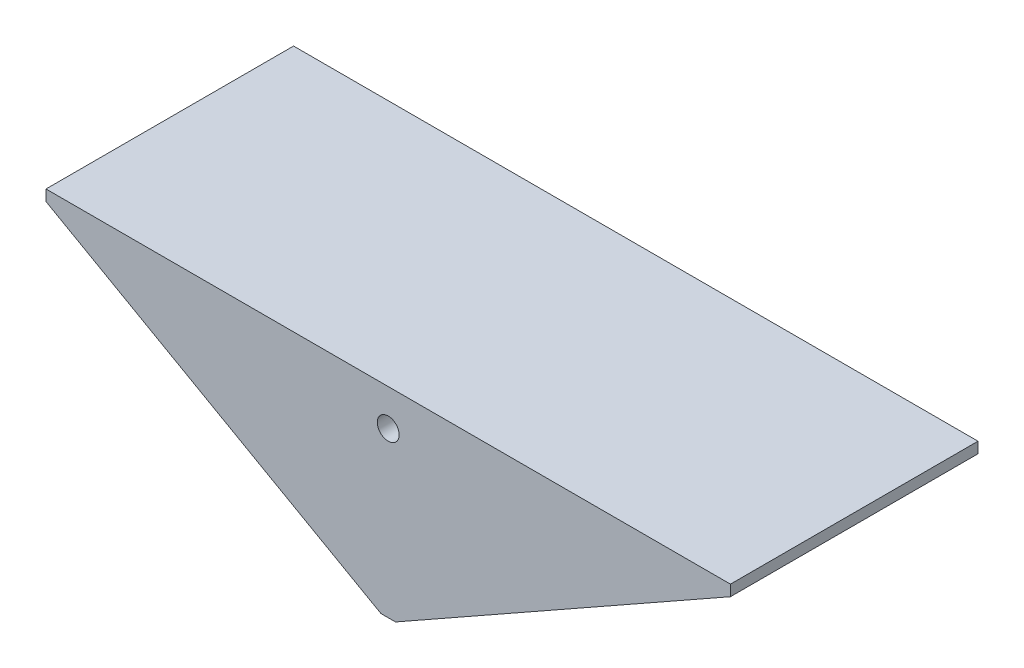
ISO-10303-21;
HEADER;
FILE_DESCRIPTION(('STEP AP214'),'2;1');
FILE_NAME('part.step','',(''),(''),'','','');
FILE_SCHEMA(('AUTOMOTIVE_DESIGN { 1 0 10303 214 1 1 1 1 }'));
ENDSEC;
DATA;
#1=APPLICATION_CONTEXT('core data for automotive mechanical design processes');
#2=APPLICATION_PROTOCOL_DEFINITION('international standard','automotive_design',2000,#1);
#3=PRODUCT_CONTEXT('',#1,'mechanical');
#4=PRODUCT('Part','Part','',(#3));
#5=PRODUCT_RELATED_PRODUCT_CATEGORY('part','',(#4));
#6=PRODUCT_DEFINITION_FORMATION('','',#4);
#7=PRODUCT_DEFINITION_CONTEXT('part definition',#1,'design');
#8=PRODUCT_DEFINITION('design','',#6,#7);
#9=PRODUCT_DEFINITION_SHAPE('','',#8);
#10=(LENGTH_UNIT() NAMED_UNIT(*) SI_UNIT(.MILLI.,.METRE.));
#11=(NAMED_UNIT(*) PLANE_ANGLE_UNIT() SI_UNIT($,.RADIAN.));
#12=(NAMED_UNIT(*) SI_UNIT($,.STERADIAN.) SOLID_ANGLE_UNIT());
#13=UNCERTAINTY_MEASURE_WITH_UNIT(LENGTH_MEASURE(1.E-05),#10,'distance_accuracy_value','');
#14=(GEOMETRIC_REPRESENTATION_CONTEXT(3) GLOBAL_UNCERTAINTY_ASSIGNED_CONTEXT((#13)) GLOBAL_UNIT_ASSIGNED_CONTEXT((#10,
#11,#12)) REPRESENTATION_CONTEXT('',''));
#15=CARTESIAN_POINT('',(0.,0.,0.));
#16=DIRECTION('',(0.,0.,1.));
#17=DIRECTION('',(1.,0.,0.));
#18=AXIS2_PLACEMENT_3D('',#15,#16,#17);
#19=CARTESIAN_POINT('',(0.,2.5,0.));
#20=DIRECTION('',(1.,0.,0.));
#21=DIRECTION('',(0.,0.,-1.));
#22=AXIS2_PLACEMENT_3D('',#19,#20,#21);
#23=PLANE('',#22);
#24=DIRECTION('',(0.,-1.,0.));
#25=VECTOR('',#24,1.);
#26=CARTESIAN_POINT('',(0.,2.5,-34.));
#27=LINE('',#26,#25);
#28=CARTESIAN_POINT('',(0.,2.5,-34.));
#29=VERTEX_POINT('',#28);
#30=CARTESIAN_POINT('',(0.,1.,-34.));
#31=VERTEX_POINT('',#30);
#32=EDGE_CURVE('E265',#29,#31,#27,.T.);
#33=ORIENTED_EDGE('',*,*,#32,.T.);
#34=DIRECTION('',(0.,0.,-1.));
#35=VECTOR('',#34,1.);
#36=CARTESIAN_POINT('',(0.,1.,0.));
#37=LINE('',#36,#35);
#38=CARTESIAN_POINT('',(0.,1.,0.));
#39=VERTEX_POINT('',#38);
#40=EDGE_CURVE('E206',#39,#31,#37,.T.);
#41=ORIENTED_EDGE('',*,*,#40,.F.);
#42=DIRECTION('',(0.,-1.,0.));
#43=VECTOR('',#42,1.);
#44=CARTESIAN_POINT('',(0.,2.5,0.));
#45=LINE('',#44,#43);
#46=CARTESIAN_POINT('',(0.,2.5,0.));
#47=VERTEX_POINT('',#46);
#48=EDGE_CURVE('E274',#47,#39,#45,.T.);
#49=ORIENTED_EDGE('',*,*,#48,.F.);
#50=DIRECTION('',(0.,0.,1.));
#51=VECTOR('',#50,1.);
#52=CARTESIAN_POINT('',(0.,2.5,0.));
#53=LINE('',#52,#51);
#54=EDGE_CURVE('E256',#29,#47,#53,.T.);
#55=ORIENTED_EDGE('',*,*,#54,.F.);
#56=EDGE_LOOP('',(#33,#41,#49,#55));
#57=FACE_BOUND('',#56,.T.);
#58=ADVANCED_FACE('F35',(#57),#23,.F.);
#59=CARTESIAN_POINT('',(0.,2.5,0.));
#60=DIRECTION('',(0.,0.,-1.));
#61=DIRECTION('',(-1.,0.,0.));
#62=AXIS2_PLACEMENT_3D('',#59,#60,#61);
#63=PLANE('',#62);
#64=CARTESIAN_POINT('',(47.,-2.5,0.));
#65=DIRECTION('',(0.,0.,-1.));
#66=DIRECTION('',(-1.,0.,0.));
#67=AXIS2_PLACEMENT_3D('',#64,#65,#66);
#68=CIRCLE('',#67,1.5);
#69=CARTESIAN_POINT('',(45.5,-2.5,0.));
#70=VERTEX_POINT('',#69);
#71=EDGE_CURVE('E168',#70,#70,#68,.T.);
#72=ORIENTED_EDGE('',*,*,#71,.T.);
#73=EDGE_LOOP('',(#72));
#74=FACE_BOUND('',#73,.T.);
#75=DIRECTION('',(0.,-1.,0.));
#76=VECTOR('',#75,1.);
#77=CARTESIAN_POINT('',(94.,2.5,0.));
#78=LINE('',#77,#76);
#79=CARTESIAN_POINT('',(94.,2.5,0.));
#80=VERTEX_POINT('',#79);
#81=CARTESIAN_POINT('',(94.,1.,0.));
#82=VERTEX_POINT('',#81);
#83=EDGE_CURVE('E271',#80,#82,#78,.T.);
#84=ORIENTED_EDGE('',*,*,#83,.F.);
#85=DIRECTION('',(1.,0.,0.));
#86=VECTOR('',#85,1.);
#87=CARTESIAN_POINT('',(0.,2.5,0.));
#88=LINE('',#87,#86);
#89=EDGE_CURVE('E259',#47,#80,#88,.T.);
#90=ORIENTED_EDGE('',*,*,#89,.F.);
#91=ORIENTED_EDGE('',*,*,#48,.T.);
#92=DIRECTION('',(0.870562838720134,-0.492057256667902,0.));
#93=VECTOR('',#92,1.);
#94=CARTESIAN_POINT('',(0.,1.,0.));
#95=LINE('',#94,#93);
#96=CARTESIAN_POINT('',(46.,-25.,0.));
#97=VERTEX_POINT('',#96);
#98=EDGE_CURVE('E203',#39,#97,#95,.T.);
#99=ORIENTED_EDGE('',*,*,#98,.T.);
#100=DIRECTION('',(-1.,0.,0.));
#101=VECTOR('',#100,1.);
#102=CARTESIAN_POINT('',(0.,-25.,0.));
#103=LINE('',#102,#101);
#104=CARTESIAN_POINT('',(48.,-25.,0.));
#105=VERTEX_POINT('',#104);
#106=EDGE_CURVE('E254',#105,#97,#103,.T.);
#107=ORIENTED_EDGE('',*,*,#106,.F.);
#108=DIRECTION('',(0.870562838720134,0.492057256667902,0.));
#109=VECTOR('',#108,1.);
#110=CARTESIAN_POINT('',(94.,1.,0.));
#111=LINE('',#110,#109);
#112=EDGE_CURVE('E188',#105,#82,#111,.T.);
#113=ORIENTED_EDGE('',*,*,#112,.T.);
#114=EDGE_LOOP('',(#84,#90,#91,#99,#107,#113));
#115=FACE_BOUND('',#114,.T.);
#116=ADVANCED_FACE('F323',(#74,#115),#63,.F.);
#117=CARTESIAN_POINT('',(94.,2.5,0.));
#118=DIRECTION('',(-1.,0.,0.));
#119=DIRECTION('',(0.,0.,1.));
#120=AXIS2_PLACEMENT_3D('',#117,#118,#119);
#121=PLANE('',#120);
#122=ORIENTED_EDGE('',*,*,#83,.T.);
#123=DIRECTION('',(0.,0.,-1.));
#124=VECTOR('',#123,1.);
#125=CARTESIAN_POINT('',(94.,1.,0.));
#126=LINE('',#125,#124);
#127=CARTESIAN_POINT('',(94.,1.,-34.));
#128=VERTEX_POINT('',#127);
#129=EDGE_CURVE('E193',#82,#128,#126,.T.);
#130=ORIENTED_EDGE('',*,*,#129,.T.);
#131=DIRECTION('',(0.,-1.,0.));
#132=VECTOR('',#131,1.);
#133=CARTESIAN_POINT('',(94.,2.5,-34.));
#134=LINE('',#133,#132);
#135=CARTESIAN_POINT('',(94.,2.5,-34.));
#136=VERTEX_POINT('',#135);
#137=EDGE_CURVE('E268',#136,#128,#134,.T.);
#138=ORIENTED_EDGE('',*,*,#137,.F.);
#139=DIRECTION('',(0.,0.,-1.));
#140=VECTOR('',#139,1.);
#141=CARTESIAN_POINT('',(94.,2.5,0.));
#142=LINE('',#141,#140);
#143=EDGE_CURVE('E261',#80,#136,#142,.T.);
#144=ORIENTED_EDGE('',*,*,#143,.F.);
#145=EDGE_LOOP('',(#122,#130,#138,#144));
#146=FACE_BOUND('',#145,.T.);
#147=ADVANCED_FACE('F320',(#146),#121,.F.);
#148=CARTESIAN_POINT('',(0.,2.5,-34.));
#149=DIRECTION('',(0.,0.,1.));
#150=DIRECTION('',(1.,0.,0.));
#151=AXIS2_PLACEMENT_3D('',#148,#149,#150);
#152=PLANE('',#151);
#153=CARTESIAN_POINT('',(47.,-2.5,-34.));
#154=DIRECTION('',(0.,0.,-1.));
#155=DIRECTION('',(-1.,0.,0.));
#156=AXIS2_PLACEMENT_3D('',#153,#154,#155);
#157=CIRCLE('',#156,1.5);
#158=CARTESIAN_POINT('',(45.5,-2.5,-34.));
#159=VERTEX_POINT('',#158);
#160=EDGE_CURVE('E172',#159,#159,#157,.T.);
#161=ORIENTED_EDGE('',*,*,#160,.F.);
#162=EDGE_LOOP('',(#161));
#163=FACE_BOUND('',#162,.T.);
#164=ORIENTED_EDGE('',*,*,#32,.F.);
#165=DIRECTION('',(-1.,0.,0.));
#166=VECTOR('',#165,1.);
#167=CARTESIAN_POINT('',(0.,2.5,-34.));
#168=LINE('',#167,#166);
#169=EDGE_CURVE('E263',#136,#29,#168,.T.);
#170=ORIENTED_EDGE('',*,*,#169,.F.);
#171=ORIENTED_EDGE('',*,*,#137,.T.);
#172=DIRECTION('',(0.870562838720134,0.492057256667902,0.));
#173=VECTOR('',#172,1.);
#174=CARTESIAN_POINT('',(94.,1.,-34.));
#175=LINE('',#174,#173);
#176=CARTESIAN_POINT('',(48.,-25.,-34.));
#177=VERTEX_POINT('',#176);
#178=EDGE_CURVE('E187',#177,#128,#175,.T.);
#179=ORIENTED_EDGE('',*,*,#178,.F.);
#180=DIRECTION('',(1.,0.,0.));
#181=VECTOR('',#180,1.);
#182=CARTESIAN_POINT('',(0.,-25.,-34.));
#183=LINE('',#182,#181);
#184=CARTESIAN_POINT('',(46.,-25.,-34.));
#185=VERTEX_POINT('',#184);
#186=EDGE_CURVE('E251',#185,#177,#183,.T.);
#187=ORIENTED_EDGE('',*,*,#186,.F.);
#188=DIRECTION('',(0.870562838720134,-0.492057256667902,0.));
#189=VECTOR('',#188,1.);
#190=CARTESIAN_POINT('',(0.,1.,-34.));
#191=LINE('',#190,#189);
#192=EDGE_CURVE('E202',#31,#185,#191,.T.);
#193=ORIENTED_EDGE('',*,*,#192,.F.);
#194=EDGE_LOOP('',(#164,#170,#171,#179,#187,#193));
#195=FACE_BOUND('',#194,.T.);
#196=ADVANCED_FACE('F314',(#163,#195),#152,.F.);
#197=CARTESIAN_POINT('',(0.,2.5,0.));
#198=DIRECTION('',(0.,-1.,0.));
#199=DIRECTION('',(0.,0.,-1.));
#200=AXIS2_PLACEMENT_3D('',#197,#198,#199);
#201=PLANE('',#200);
#202=ORIENTED_EDGE('',*,*,#89,.T.);
#203=ORIENTED_EDGE('',*,*,#143,.T.);
#204=ORIENTED_EDGE('',*,*,#169,.T.);
#205=ORIENTED_EDGE('',*,*,#54,.T.);
#206=EDGE_LOOP('',(#202,#203,#204,#205));
#207=FACE_BOUND('',#206,.T.);
#208=ADVANCED_FACE('F340',(#207),#201,.F.);
#209=CARTESIAN_POINT('',(0.,-25.,0.));
#210=DIRECTION('',(0.,-1.,0.));
#211=DIRECTION('',(0.,0.,-1.));
#212=AXIS2_PLACEMENT_3D('',#209,#210,#211);
#213=PLANE('',#212);
#214=DIRECTION('',(0.,0.,-1.));
#215=VECTOR('',#214,1.);
#216=CARTESIAN_POINT('',(48.,-25.,0.));
#217=LINE('',#216,#215);
#218=CARTESIAN_POINT('',(48.,-25.,-1.99999999999999));
#219=VERTEX_POINT('',#218);
#220=EDGE_CURVE('E197',#105,#219,#217,.T.);
#221=ORIENTED_EDGE('',*,*,#220,.F.);
#222=ORIENTED_EDGE('',*,*,#106,.T.);
#223=DIRECTION('',(0.,0.,-1.));
#224=VECTOR('',#223,1.);
#225=CARTESIAN_POINT('',(46.,-25.,0.));
#226=LINE('',#225,#224);
#227=CARTESIAN_POINT('',(46.,-25.,-2.));
#228=VERTEX_POINT('',#227);
#229=EDGE_CURVE('E208',#97,#228,#226,.T.);
#230=ORIENTED_EDGE('',*,*,#229,.T.);
#231=DIRECTION('',(0.,0.,1.));
#232=VECTOR('',#231,1.);
#233=CARTESIAN_POINT('',(46.,-25.,-32.));
#234=LINE('',#233,#232);
#235=CARTESIAN_POINT('',(46.,-25.,-32.));
#236=VERTEX_POINT('',#235);
#237=EDGE_CURVE('E238',#236,#228,#234,.T.);
#238=ORIENTED_EDGE('',*,*,#237,.F.);
#239=EDGE_CURVE('E212',#236,#185,#226,.T.);
#240=ORIENTED_EDGE('',*,*,#239,.T.);
#241=ORIENTED_EDGE('',*,*,#186,.T.);
#242=CARTESIAN_POINT('',(48.,-25.,-32.));
#243=VERTEX_POINT('',#242);
#244=EDGE_CURVE('E191',#243,#177,#217,.T.);
#245=ORIENTED_EDGE('',*,*,#244,.F.);
#246=DIRECTION('',(0.,0.,-1.));
#247=VECTOR('',#246,1.);
#248=CARTESIAN_POINT('',(48.,-25.,-32.));
#249=LINE('',#248,#247);
#250=EDGE_CURVE('E218',#219,#243,#249,.T.);
#251=ORIENTED_EDGE('',*,*,#250,.F.);
#252=EDGE_LOOP('',(#221,#222,#230,#238,#240,#241,#245,#251));
#253=FACE_BOUND('',#252,.T.);
#254=ADVANCED_FACE('F307',(#253),#213,.T.);
#255=CARTESIAN_POINT('',(2.,-25.,-2.));
#256=DIRECTION('',(1.,0.,0.));
#257=DIRECTION('',(0.,0.,-1.));
#258=AXIS2_PLACEMENT_3D('',#255,#256,#257);
#259=PLANE('',#258);
#260=DIRECTION('',(0.,0.,1.));
#261=VECTOR('',#260,1.);
#262=CARTESIAN_POINT('',(2.,-0.130434782608692,-2.));
#263=LINE('',#262,#261);
#264=CARTESIAN_POINT('',(2.,-0.130434782608692,-32.));
#265=VERTEX_POINT('',#264);
#266=CARTESIAN_POINT('',(2.,-0.130434782608696,-2.));
#267=VERTEX_POINT('',#266);
#268=EDGE_CURVE('E211',#265,#267,#263,.T.);
#269=ORIENTED_EDGE('',*,*,#268,.F.);
#270=DIRECTION('',(0.,1.,0.));
#271=VECTOR('',#270,1.);
#272=CARTESIAN_POINT('',(2.,-25.,-32.));
#273=LINE('',#272,#271);
#274=CARTESIAN_POINT('',(2.,0.,-32.));
#275=VERTEX_POINT('',#274);
#276=EDGE_CURVE('E249',#265,#275,#273,.T.);
#277=ORIENTED_EDGE('',*,*,#276,.T.);
#278=DIRECTION('',(0.,0.,-1.));
#279=VECTOR('',#278,1.);
#280=CARTESIAN_POINT('',(2.,0.,-2.));
#281=LINE('',#280,#279);
#282=CARTESIAN_POINT('',(2.,0.,-2.));
#283=VERTEX_POINT('',#282);
#284=EDGE_CURVE('E154',#283,#275,#281,.T.);
#285=ORIENTED_EDGE('',*,*,#284,.F.);
#286=DIRECTION('',(0.,1.,0.));
#287=VECTOR('',#286,1.);
#288=CARTESIAN_POINT('',(2.,-25.,-2.));
#289=LINE('',#288,#287);
#290=EDGE_CURVE('E241',#267,#283,#289,.T.);
#291=ORIENTED_EDGE('',*,*,#290,.F.);
#292=EDGE_LOOP('',(#269,#277,#285,#291));
#293=FACE_BOUND('',#292,.T.);
#294=ADVANCED_FACE('F334',(#293),#259,.T.);
#295=CARTESIAN_POINT('',(2.,-25.,-32.));
#296=DIRECTION('',(0.,0.,1.));
#297=DIRECTION('',(1.,0.,0.));
#298=AXIS2_PLACEMENT_3D('',#295,#296,#297);
#299=PLANE('',#298);
#300=CARTESIAN_POINT('',(47.,-2.5,-32.));
#301=DIRECTION('',(0.,0.,1.));
#302=DIRECTION('',(1.,0.,0.));
#303=AXIS2_PLACEMENT_3D('',#300,#301,#302);
#304=CIRCLE('',#303,5.);
#305=CARTESIAN_POINT('',(42.6698729810778,0.,-32.));
#306=VERTEX_POINT('',#305);
#307=CARTESIAN_POINT('',(46.,-7.39897948556635,-32.));
#308=VERTEX_POINT('',#307);
#309=EDGE_CURVE('E160',#306,#308,#304,.T.);
#310=ORIENTED_EDGE('',*,*,#309,.F.);
#311=DIRECTION('',(1.,0.,0.));
#312=VECTOR('',#311,1.);
#313=CARTESIAN_POINT('',(2.,0.,-32.));
#314=LINE('',#313,#312);
#315=EDGE_CURVE('E150',#275,#306,#314,.T.);
#316=ORIENTED_EDGE('',*,*,#315,.F.);
#317=ORIENTED_EDGE('',*,*,#276,.F.);
#318=DIRECTION('',(-0.870562838720134,0.492057256667902,0.));
#319=VECTOR('',#318,1.);
#320=CARTESIAN_POINT('',(12.6532951289398,-6.15186246418338,-32.));
#321=LINE('',#320,#319);
#322=EDGE_CURVE('E215',#236,#265,#321,.T.);
#323=ORIENTED_EDGE('',*,*,#322,.F.);
#324=DIRECTION('',(0.,1.,0.));
#325=VECTOR('',#324,1.);
#326=CARTESIAN_POINT('',(46.,-25.,-32.));
#327=LINE('',#326,#325);
#328=EDGE_CURVE('E163',#236,#308,#327,.T.);
#329=ORIENTED_EDGE('',*,*,#328,.T.);
#330=EDGE_LOOP('',(#310,#316,#317,#323,#329));
#331=FACE_BOUND('',#330,.T.);
#332=ADVANCED_FACE('F161',(#331),#299,.T.);
#333=CARTESIAN_POINT('',(46.,-25.,-32.));
#334=DIRECTION('',(-1.,0.,0.));
#335=DIRECTION('',(0.,0.,1.));
#336=AXIS2_PLACEMENT_3D('',#333,#334,#335);
#337=PLANE('',#336);
#338=DIRECTION('',(0.,0.,-1.));
#339=VECTOR('',#338,1.);
#340=CARTESIAN_POINT('',(46.,-7.39897948556635,0.));
#341=LINE('',#340,#339);
#342=CARTESIAN_POINT('',(46.,-7.39897948556635,-1.99999999999999));
#343=VERTEX_POINT('',#342);
#344=EDGE_CURVE('E49',#308,#343,#341,.F.);
#345=ORIENTED_EDGE('',*,*,#344,.F.);
#346=ORIENTED_EDGE('',*,*,#328,.F.);
#347=ORIENTED_EDGE('',*,*,#237,.T.);
#348=DIRECTION('',(0.,1.,0.));
#349=VECTOR('',#348,1.);
#350=CARTESIAN_POINT('',(46.,-25.,-1.99999999999999));
#351=LINE('',#350,#349);
#352=EDGE_CURVE('E246',#228,#343,#351,.T.);
#353=ORIENTED_EDGE('',*,*,#352,.T.);
#354=EDGE_LOOP('',(#345,#346,#347,#353));
#355=FACE_BOUND('',#354,.T.);
#356=ADVANCED_FACE('F335',(#355),#337,.T.);
#357=CARTESIAN_POINT('',(2.,-25.,-2.));
#358=DIRECTION('',(0.,0.,-1.));
#359=DIRECTION('',(-1.,0.,0.));
#360=AXIS2_PLACEMENT_3D('',#357,#358,#359);
#361=PLANE('',#360);
#362=CARTESIAN_POINT('',(47.,-2.5,-1.99999999999999));
#363=DIRECTION('',(0.,0.,-1.));
#364=DIRECTION('',(-1.,0.,0.));
#365=AXIS2_PLACEMENT_3D('',#362,#363,#364);
#366=CIRCLE('',#365,5.);
#367=CARTESIAN_POINT('',(42.6698729810778,0.,-2.));
#368=VERTEX_POINT('',#367);
#369=EDGE_CURVE('E57',#343,#368,#366,.T.);
#370=ORIENTED_EDGE('',*,*,#369,.F.);
#371=ORIENTED_EDGE('',*,*,#352,.F.);
#372=DIRECTION('',(0.870562838720134,-0.492057256667902,0.));
#373=VECTOR('',#372,1.);
#374=CARTESIAN_POINT('',(12.6532951289398,-6.15186246418338,-2.));
#375=LINE('',#374,#373);
#376=EDGE_CURVE('E277',#267,#228,#375,.T.);
#377=ORIENTED_EDGE('',*,*,#376,.F.);
#378=ORIENTED_EDGE('',*,*,#290,.T.);
#379=DIRECTION('',(-1.,0.,0.));
#380=VECTOR('',#379,1.);
#381=CARTESIAN_POINT('',(2.,0.,-2.));
#382=LINE('',#381,#380);
#383=EDGE_CURVE('E157',#368,#283,#382,.T.);
#384=ORIENTED_EDGE('',*,*,#383,.F.);
#385=EDGE_LOOP('',(#370,#371,#377,#378,#384));
#386=FACE_BOUND('',#385,.T.);
#387=ADVANCED_FACE('F332',(#386),#361,.T.);
#388=CARTESIAN_POINT('',(48.,-25.,-1.99999999999999));
#389=DIRECTION('',(0.,0.,-1.));
#390=DIRECTION('',(-1.,0.,0.));
#391=AXIS2_PLACEMENT_3D('',#388,#389,#390);
#392=PLANE('',#391);
#393=CARTESIAN_POINT('',(47.,-2.5,-1.99999999999999));
#394=DIRECTION('',(0.,0.,-1.));
#395=DIRECTION('',(-1.,0.,0.));
#396=AXIS2_PLACEMENT_3D('',#393,#394,#395);
#397=CIRCLE('',#396,5.);
#398=CARTESIAN_POINT('',(51.3301270189222,0.,-1.99999999999999));
#399=VERTEX_POINT('',#398);
#400=CARTESIAN_POINT('',(48.,-7.39897948556635,-1.99999999999999));
#401=VERTEX_POINT('',#400);
#402=EDGE_CURVE('E184',#399,#401,#397,.T.);
#403=ORIENTED_EDGE('',*,*,#402,.F.);
#404=DIRECTION('',(-1.,0.,0.));
#405=VECTOR('',#404,1.);
#406=CARTESIAN_POINT('',(48.,0.,-1.99999999999999));
#407=LINE('',#406,#405);
#408=CARTESIAN_POINT('',(92.,0.,-2.));
#409=VERTEX_POINT('',#408);
#410=EDGE_CURVE('E217',#409,#399,#407,.T.);
#411=ORIENTED_EDGE('',*,*,#410,.F.);
#412=DIRECTION('',(0.,1.,0.));
#413=VECTOR('',#412,1.);
#414=CARTESIAN_POINT('',(92.,-25.,-2.));
#415=LINE('',#414,#413);
#416=CARTESIAN_POINT('',(92.,-0.130434782608695,-2.));
#417=VERTEX_POINT('',#416);
#418=EDGE_CURVE('E221',#417,#409,#415,.T.);
#419=ORIENTED_EDGE('',*,*,#418,.F.);
#420=DIRECTION('',(0.870562838720134,0.492057256667902,0.));
#421=VECTOR('',#420,1.);
#422=CARTESIAN_POINT('',(48.,-25.,-1.99999999999999));
#423=LINE('',#422,#421);
#424=EDGE_CURVE('E200',#219,#417,#423,.T.);
#425=ORIENTED_EDGE('',*,*,#424,.F.);
#426=DIRECTION('',(0.,1.,0.));
#427=VECTOR('',#426,1.);
#428=CARTESIAN_POINT('',(48.,-25.,-1.99999999999999));
#429=LINE('',#428,#427);
#430=EDGE_CURVE('E235',#219,#401,#429,.T.);
#431=ORIENTED_EDGE('',*,*,#430,.T.);
#432=EDGE_LOOP('',(#403,#411,#419,#425,#431));
#433=FACE_BOUND('',#432,.T.);
#434=ADVANCED_FACE('F298',(#433),#392,.T.);
#435=CARTESIAN_POINT('',(48.,-25.,-32.));
#436=DIRECTION('',(1.,0.,0.));
#437=DIRECTION('',(0.,0.,-1.));
#438=AXIS2_PLACEMENT_3D('',#435,#436,#437);
#439=PLANE('',#438);
#440=DIRECTION('',(0.,0.,-1.));
#441=VECTOR('',#440,1.);
#442=CARTESIAN_POINT('',(48.,-7.39897948556635,0.));
#443=LINE('',#442,#441);
#444=CARTESIAN_POINT('',(48.,-7.39897948556635,-32.));
#445=VERTEX_POINT('',#444);
#446=EDGE_CURVE('E181',#401,#445,#443,.T.);
#447=ORIENTED_EDGE('',*,*,#446,.F.);
#448=ORIENTED_EDGE('',*,*,#430,.F.);
#449=ORIENTED_EDGE('',*,*,#250,.T.);
#450=DIRECTION('',(0.,1.,0.));
#451=VECTOR('',#450,1.);
#452=CARTESIAN_POINT('',(48.,-25.,-32.));
#453=LINE('',#452,#451);
#454=EDGE_CURVE('E232',#243,#445,#453,.T.);
#455=ORIENTED_EDGE('',*,*,#454,.T.);
#456=EDGE_LOOP('',(#447,#448,#449,#455));
#457=FACE_BOUND('',#456,.T.);
#458=ADVANCED_FACE('F303',(#457),#439,.T.);
#459=CARTESIAN_POINT('',(48.,-25.,-32.));
#460=DIRECTION('',(0.,0.,1.));
#461=DIRECTION('',(1.,0.,0.));
#462=AXIS2_PLACEMENT_3D('',#459,#460,#461);
#463=PLANE('',#462);
#464=CARTESIAN_POINT('',(47.,-2.5,-32.));
#465=DIRECTION('',(0.,0.,1.));
#466=DIRECTION('',(1.,0.,0.));
#467=AXIS2_PLACEMENT_3D('',#464,#465,#466);
#468=CIRCLE('',#467,5.);
#469=CARTESIAN_POINT('',(51.3301270189222,0.,-32.));
#470=VERTEX_POINT('',#469);
#471=EDGE_CURVE('E178',#445,#470,#468,.T.);
#472=ORIENTED_EDGE('',*,*,#471,.F.);
#473=ORIENTED_EDGE('',*,*,#454,.F.);
#474=DIRECTION('',(-0.870562838720134,-0.492057256667902,0.));
#475=VECTOR('',#474,1.);
#476=CARTESIAN_POINT('',(48.,-25.,-32.));
#477=LINE('',#476,#475);
#478=CARTESIAN_POINT('',(92.,-0.130434782608695,-32.));
#479=VERTEX_POINT('',#478);
#480=EDGE_CURVE('E196',#479,#243,#477,.T.);
#481=ORIENTED_EDGE('',*,*,#480,.F.);
#482=DIRECTION('',(0.,1.,0.));
#483=VECTOR('',#482,1.);
#484=CARTESIAN_POINT('',(92.,-25.,-32.));
#485=LINE('',#484,#483);
#486=CARTESIAN_POINT('',(92.,0.,-32.));
#487=VERTEX_POINT('',#486);
#488=EDGE_CURVE('E229',#479,#487,#485,.T.);
#489=ORIENTED_EDGE('',*,*,#488,.T.);
#490=DIRECTION('',(1.,0.,0.));
#491=VECTOR('',#490,1.);
#492=CARTESIAN_POINT('',(48.,0.,-32.));
#493=LINE('',#492,#491);
#494=EDGE_CURVE('E224',#470,#487,#493,.T.);
#495=ORIENTED_EDGE('',*,*,#494,.F.);
#496=EDGE_LOOP('',(#472,#473,#481,#489,#495));
#497=FACE_BOUND('',#496,.T.);
#498=ADVANCED_FACE('F289',(#497),#463,.T.);
#499=CARTESIAN_POINT('',(92.,-25.,-2.));
#500=DIRECTION('',(-1.,0.,0.));
#501=DIRECTION('',(0.,0.,1.));
#502=AXIS2_PLACEMENT_3D('',#499,#500,#501);
#503=PLANE('',#502);
#504=DIRECTION('',(0.,0.,-1.));
#505=VECTOR('',#504,1.);
#506=CARTESIAN_POINT('',(92.,-0.130434782608695,-2.));
#507=LINE('',#506,#505);
#508=EDGE_CURVE('E42',#417,#479,#507,.T.);
#509=ORIENTED_EDGE('',*,*,#508,.F.);
#510=ORIENTED_EDGE('',*,*,#418,.T.);
#511=DIRECTION('',(0.,0.,1.));
#512=VECTOR('',#511,1.);
#513=CARTESIAN_POINT('',(92.,0.,-2.));
#514=LINE('',#513,#512);
#515=EDGE_CURVE('E222',#487,#409,#514,.T.);
#516=ORIENTED_EDGE('',*,*,#515,.F.);
#517=ORIENTED_EDGE('',*,*,#488,.F.);
#518=EDGE_LOOP('',(#509,#510,#516,#517));
#519=FACE_BOUND('',#518,.T.);
#520=ADVANCED_FACE('F292',(#519),#503,.T.);
#521=CARTESIAN_POINT('',(0.,0.,0.));
#522=DIRECTION('',(0.,-1.,0.));
#523=DIRECTION('',(0.,0.,-1.));
#524=AXIS2_PLACEMENT_3D('',#521,#522,#523);
#525=PLANE('',#524);
#526=DIRECTION('',(0.,0.,-1.));
#527=VECTOR('',#526,1.);
#528=CARTESIAN_POINT('',(51.3301270189222,0.,0.));
#529=LINE('',#528,#527);
#530=EDGE_CURVE('E165',#470,#399,#529,.F.);
#531=ORIENTED_EDGE('',*,*,#530,.F.);
#532=ORIENTED_EDGE('',*,*,#494,.T.);
#533=ORIENTED_EDGE('',*,*,#515,.T.);
#534=ORIENTED_EDGE('',*,*,#410,.T.);
#535=EDGE_LOOP('',(#531,#532,#533,#534));
#536=FACE_BOUND('',#535,.T.);
#537=ADVANCED_FACE('F295',(#536),#525,.T.);
#538=DIRECTION('',(0.,0.,-1.));
#539=VECTOR('',#538,1.);
#540=CARTESIAN_POINT('',(42.6698729810778,0.,0.));
#541=LINE('',#540,#539);
#542=EDGE_CURVE('E11',#368,#306,#541,.T.);
#543=ORIENTED_EDGE('',*,*,#542,.F.);
#544=ORIENTED_EDGE('',*,*,#383,.T.);
#545=ORIENTED_EDGE('',*,*,#284,.T.);
#546=ORIENTED_EDGE('',*,*,#315,.T.);
#547=EDGE_LOOP('',(#543,#544,#545,#546));
#548=FACE_BOUND('',#547,.T.);
#549=ADVANCED_FACE('F152',(#548),#525,.T.);
#550=CARTESIAN_POINT('',(0.,1.,0.));
#551=DIRECTION('',(0.492057256667902,0.870562838720134,0.));
#552=DIRECTION('',(-0.870562838720134,0.492057256667902,0.));
#553=AXIS2_PLACEMENT_3D('',#550,#551,#552);
#554=PLANE('',#553);
#555=ORIENTED_EDGE('',*,*,#322,.T.);
#556=ORIENTED_EDGE('',*,*,#268,.T.);
#557=ORIENTED_EDGE('',*,*,#376,.T.);
#558=ORIENTED_EDGE('',*,*,#229,.F.);
#559=ORIENTED_EDGE('',*,*,#98,.F.);
#560=ORIENTED_EDGE('',*,*,#40,.T.);
#561=ORIENTED_EDGE('',*,*,#192,.T.);
#562=ORIENTED_EDGE('',*,*,#239,.F.);
#563=EDGE_LOOP('',(#555,#556,#557,#558,#559,#560,#561,#562));
#564=FACE_BOUND('',#563,.T.);
#565=ADVANCED_FACE('F327',(#564),#554,.F.);
#566=CARTESIAN_POINT('',(94.,1.,0.));
#567=DIRECTION('',(-0.492057256667902,0.870562838720134,0.));
#568=DIRECTION('',(-0.870562838720134,-0.492057256667902,0.));
#569=AXIS2_PLACEMENT_3D('',#566,#567,#568);
#570=PLANE('',#569);
#571=ORIENTED_EDGE('',*,*,#424,.T.);
#572=ORIENTED_EDGE('',*,*,#508,.T.);
#573=ORIENTED_EDGE('',*,*,#480,.T.);
#574=ORIENTED_EDGE('',*,*,#244,.T.);
#575=ORIENTED_EDGE('',*,*,#178,.T.);
#576=ORIENTED_EDGE('',*,*,#129,.F.);
#577=ORIENTED_EDGE('',*,*,#112,.F.);
#578=ORIENTED_EDGE('',*,*,#220,.T.);
#579=EDGE_LOOP('',(#571,#572,#573,#574,#575,#576,#577,#578));
#580=FACE_BOUND('',#579,.T.);
#581=ADVANCED_FACE('F281',(#580),#570,.F.);
#582=CARTESIAN_POINT('',(47.,-2.5,0.));
#583=DIRECTION('',(0.,0.,-1.));
#584=DIRECTION('',(-1.,0.,0.));
#585=AXIS2_PLACEMENT_3D('',#582,#583,#584);
#586=CYLINDRICAL_SURFACE('',#585,5.);
#587=ORIENTED_EDGE('',*,*,#542,.T.);
#588=ORIENTED_EDGE('',*,*,#309,.T.);
#589=ORIENTED_EDGE('',*,*,#344,.T.);
#590=ORIENTED_EDGE('',*,*,#369,.T.);
#591=EDGE_LOOP('',(#587,#588,#589,#590));
#592=FACE_BOUND('',#591,.T.);
#593=ADVANCED_FACE('F167',(#592),#586,.T.);
#594=ORIENTED_EDGE('',*,*,#530,.T.);
#595=ORIENTED_EDGE('',*,*,#402,.T.);
#596=ORIENTED_EDGE('',*,*,#446,.T.);
#597=ORIENTED_EDGE('',*,*,#471,.T.);
#598=EDGE_LOOP('',(#594,#595,#596,#597));
#599=FACE_BOUND('',#598,.T.);
#600=ADVANCED_FACE('F301',(#599),#586,.T.);
#601=CARTESIAN_POINT('',(47.,-2.5,0.));
#602=DIRECTION('',(0.,0.,-1.));
#603=DIRECTION('',(-1.,0.,0.));
#604=AXIS2_PLACEMENT_3D('',#601,#602,#603);
#605=CYLINDRICAL_SURFACE('',#604,1.5);
#606=ORIENTED_EDGE('',*,*,#71,.F.);
#607=EDGE_LOOP('',(#606));
#608=FACE_BOUND('',#607,.T.);
#609=ORIENTED_EDGE('',*,*,#160,.T.);
#610=EDGE_LOOP('',(#609));
#611=FACE_BOUND('',#610,.T.);
#612=ADVANCED_FACE('F460',(#608,#611),#605,.F.);
#613=CLOSED_SHELL('',(#58,#116,#147,#196,#208,#254,#294,#332,#356,#387,#434,#458,#498,#520,#537,
#549,#565,#581,#593,#600,#612));
#614=MANIFOLD_SOLID_BREP('B2',#613);
#615=ADVANCED_BREP_SHAPE_REPRESENTATION('',(#18,#614),#14);
#616=SHAPE_DEFINITION_REPRESENTATION(#9,#615);
ENDSEC;
END-ISO-10303-21;
